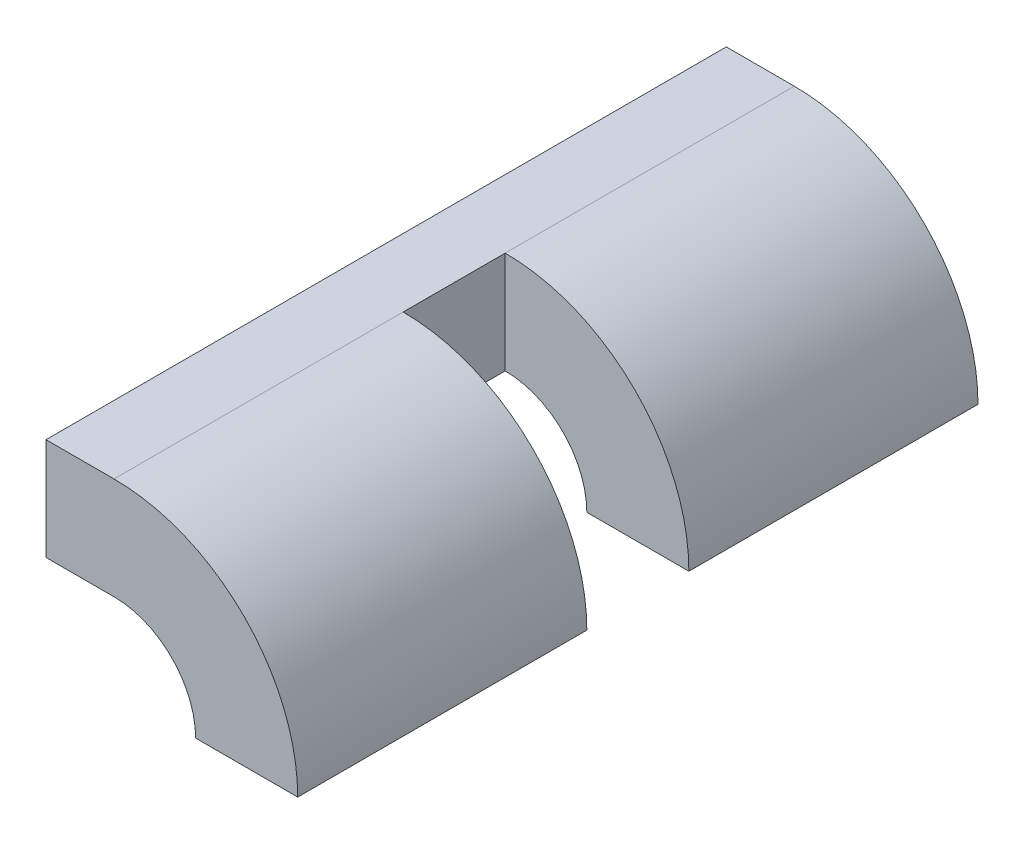
ISO-10303-21;
HEADER;
FILE_DESCRIPTION(('STEP AP214'),'2;1');
FILE_NAME('part.step','',(''),(''),'','','');
FILE_SCHEMA(('AUTOMOTIVE_DESIGN { 1 0 10303 214 1 1 1 1 }'));
ENDSEC;
DATA;
#1=APPLICATION_CONTEXT('core data for automotive mechanical design processes');
#2=APPLICATION_PROTOCOL_DEFINITION('international standard','automotive_design',2000,#1);
#3=PRODUCT_CONTEXT('',#1,'mechanical');
#4=PRODUCT('Part','Part','',(#3));
#5=PRODUCT_RELATED_PRODUCT_CATEGORY('part','',(#4));
#6=PRODUCT_DEFINITION_FORMATION('','',#4);
#7=PRODUCT_DEFINITION_CONTEXT('part definition',#1,'design');
#8=PRODUCT_DEFINITION('design','',#6,#7);
#9=PRODUCT_DEFINITION_SHAPE('','',#8);
#10=(LENGTH_UNIT() NAMED_UNIT(*) SI_UNIT(.MILLI.,.METRE.));
#11=(NAMED_UNIT(*) PLANE_ANGLE_UNIT() SI_UNIT($,.RADIAN.));
#12=(NAMED_UNIT(*) SI_UNIT($,.STERADIAN.) SOLID_ANGLE_UNIT());
#13=UNCERTAINTY_MEASURE_WITH_UNIT(LENGTH_MEASURE(1.E-05),#10,'distance_accuracy_value','');
#14=(GEOMETRIC_REPRESENTATION_CONTEXT(3) GLOBAL_UNCERTAINTY_ASSIGNED_CONTEXT((#13)) GLOBAL_UNIT_ASSIGNED_CONTEXT((#10,
#11,#12)) REPRESENTATION_CONTEXT('',''));
#15=CARTESIAN_POINT('',(0.,0.,0.));
#16=DIRECTION('',(0.,0.,1.));
#17=DIRECTION('',(1.,0.,0.));
#18=AXIS2_PLACEMENT_3D('',#15,#16,#17);
#19=CARTESIAN_POINT('',(20.,-24.,200.));
#20=DIRECTION('',(0.,0.,-1.));
#21=DIRECTION('',(-1.,0.,0.));
#22=AXIS2_PLACEMENT_3D('',#19,#20,#21);
#23=CYLINDRICAL_SURFACE('',#22,24.);
#24=CARTESIAN_POINT('',(20.,-24.,85.));
#25=DIRECTION('',(0.,0.,1.));
#26=DIRECTION('',(0.,-1.,0.));
#27=AXIS2_PLACEMENT_3D('',#24,#25,#26);
#28=CIRCLE('',#27,24.);
#29=CARTESIAN_POINT('',(20.,0.,85.));
#30=VERTEX_POINT('',#29);
#31=CARTESIAN_POINT('',(44.,-24.,85.));
#32=VERTEX_POINT('',#31);
#33=EDGE_CURVE('E128',#30,#32,#28,.F.);
#34=ORIENTED_EDGE('',*,*,#33,.F.);
#35=DIRECTION('',(0.,0.,-1.));
#36=VECTOR('',#35,1.);
#37=CARTESIAN_POINT('',(20.,0.,200.));
#38=LINE('',#37,#36);
#39=CARTESIAN_POINT('',(20.,0.,0.));
#40=VERTEX_POINT('',#39);
#41=EDGE_CURVE('E195',#30,#40,#38,.T.);
#42=ORIENTED_EDGE('',*,*,#41,.T.);
#43=CARTESIAN_POINT('',(20.,-24.,0.));
#44=DIRECTION('',(0.,0.,1.));
#45=DIRECTION('',(1.,0.,0.));
#46=AXIS2_PLACEMENT_3D('',#43,#44,#45);
#47=CIRCLE('',#46,24.);
#48=CARTESIAN_POINT('',(44.,-24.,0.));
#49=VERTEX_POINT('',#48);
#50=EDGE_CURVE('E215',#40,#49,#47,.F.);
#51=ORIENTED_EDGE('',*,*,#50,.T.);
#52=DIRECTION('',(0.,0.,-1.));
#53=VECTOR('',#52,1.);
#54=CARTESIAN_POINT('',(44.,-24.,200.));
#55=LINE('',#54,#53);
#56=EDGE_CURVE('E154',#32,#49,#55,.T.);
#57=ORIENTED_EDGE('',*,*,#56,.F.);
#58=EDGE_LOOP('',(#34,#42,#51,#57));
#59=FACE_BOUND('',#58,.T.);
#60=ADVANCED_FACE('F41',(#59),#23,.F.);
#61=CARTESIAN_POINT('',(20.,-24.,115.));
#62=DIRECTION('',(0.,0.,-1.));
#63=DIRECTION('',(-1.,0.,0.));
#64=AXIS2_PLACEMENT_3D('',#61,#62,#63);
#65=CIRCLE('',#64,24.);
#66=CARTESIAN_POINT('',(44.,-24.,115.));
#67=VERTEX_POINT('',#66);
#68=CARTESIAN_POINT('',(20.,0.,115.));
#69=VERTEX_POINT('',#68);
#70=EDGE_CURVE('E232',#67,#69,#65,.F.);
#71=ORIENTED_EDGE('',*,*,#70,.F.);
#72=CARTESIAN_POINT('',(44.,-24.,200.));
#73=VERTEX_POINT('',#72);
#74=EDGE_CURVE('E162',#73,#67,#55,.T.);
#75=ORIENTED_EDGE('',*,*,#74,.F.);
#76=CARTESIAN_POINT('',(20.,-24.,200.));
#77=DIRECTION('',(0.,0.,1.));
#78=DIRECTION('',(1.,0.,0.));
#79=AXIS2_PLACEMENT_3D('',#76,#77,#78);
#80=CIRCLE('',#79,24.);
#81=CARTESIAN_POINT('',(20.,0.,200.));
#82=VERTEX_POINT('',#81);
#83=EDGE_CURVE('E224',#82,#73,#80,.F.);
#84=ORIENTED_EDGE('',*,*,#83,.F.);
#85=EDGE_CURVE('E191',#82,#69,#38,.T.);
#86=ORIENTED_EDGE('',*,*,#85,.T.);
#87=EDGE_LOOP('',(#71,#75,#84,#86));
#88=FACE_BOUND('',#87,.T.);
#89=ADVANCED_FACE('F261',(#88),#23,.F.);
#90=CARTESIAN_POINT('',(0.,-24.,200.));
#91=DIRECTION('',(0.,1.,0.));
#92=DIRECTION('',(0.,0.,1.));
#93=AXIS2_PLACEMENT_3D('',#90,#91,#92);
#94=PLANE('',#93);
#95=DIRECTION('',(1.,0.,0.));
#96=VECTOR('',#95,1.);
#97=CARTESIAN_POINT('',(20.,-24.,85.));
#98=LINE('',#97,#96);
#99=CARTESIAN_POINT('',(74.,-24.,85.));
#100=VERTEX_POINT('',#99);
#101=EDGE_CURVE('E124',#32,#100,#98,.T.);
#102=ORIENTED_EDGE('',*,*,#101,.F.);
#103=ORIENTED_EDGE('',*,*,#56,.T.);
#104=DIRECTION('',(1.,0.,0.));
#105=VECTOR('',#104,1.);
#106=CARTESIAN_POINT('',(0.,-24.,0.));
#107=LINE('',#106,#105);
#108=CARTESIAN_POINT('',(74.,-24.,0.));
#109=VERTEX_POINT('',#108);
#110=EDGE_CURVE('E145',#49,#109,#107,.T.);
#111=ORIENTED_EDGE('',*,*,#110,.T.);
#112=DIRECTION('',(0.,0.,-1.));
#113=VECTOR('',#112,1.);
#114=CARTESIAN_POINT('',(74.,-24.,200.));
#115=LINE('',#114,#113);
#116=EDGE_CURVE('E139',#100,#109,#115,.T.);
#117=ORIENTED_EDGE('',*,*,#116,.F.);
#118=EDGE_LOOP('',(#102,#103,#111,#117));
#119=FACE_BOUND('',#118,.T.);
#120=ADVANCED_FACE('F143',(#119),#94,.F.);
#121=DIRECTION('',(1.,0.,0.));
#122=VECTOR('',#121,1.);
#123=CARTESIAN_POINT('',(20.,-24.,115.));
#124=LINE('',#123,#122);
#125=CARTESIAN_POINT('',(74.,-24.,115.));
#126=VERTEX_POINT('',#125);
#127=EDGE_CURVE('E134',#67,#126,#124,.T.);
#128=ORIENTED_EDGE('',*,*,#127,.T.);
#129=CARTESIAN_POINT('',(74.,-24.,200.));
#130=VERTEX_POINT('',#129);
#131=EDGE_CURVE('E148',#130,#126,#115,.T.);
#132=ORIENTED_EDGE('',*,*,#131,.F.);
#133=DIRECTION('',(1.,0.,0.));
#134=VECTOR('',#133,1.);
#135=CARTESIAN_POINT('',(0.,-24.,200.));
#136=LINE('',#135,#134);
#137=EDGE_CURVE('E156',#73,#130,#136,.T.);
#138=ORIENTED_EDGE('',*,*,#137,.F.);
#139=ORIENTED_EDGE('',*,*,#74,.T.);
#140=EDGE_LOOP('',(#128,#132,#138,#139));
#141=FACE_BOUND('',#140,.T.);
#142=ADVANCED_FACE('F257',(#141),#94,.F.);
#143=CARTESIAN_POINT('',(20.,-24.,200.));
#144=DIRECTION('',(0.,0.,-1.));
#145=DIRECTION('',(-1.,0.,0.));
#146=AXIS2_PLACEMENT_3D('',#143,#144,#145);
#147=CYLINDRICAL_SURFACE('',#146,54.);
#148=DIRECTION('',(0.,0.,-1.));
#149=VECTOR('',#148,1.);
#150=CARTESIAN_POINT('',(20.,30.,200.));
#151=LINE('',#150,#149);
#152=CARTESIAN_POINT('',(20.,30.,85.));
#153=VERTEX_POINT('',#152);
#154=CARTESIAN_POINT('',(20.,30.,0.));
#155=VERTEX_POINT('',#154);
#156=EDGE_CURVE('E141',#153,#155,#151,.T.);
#157=ORIENTED_EDGE('',*,*,#156,.F.);
#158=CARTESIAN_POINT('',(20.,-24.,85.));
#159=DIRECTION('',(0.,0.,1.));
#160=DIRECTION('',(0.,-1.,0.));
#161=AXIS2_PLACEMENT_3D('',#158,#159,#160);
#162=CIRCLE('',#161,54.);
#163=EDGE_CURVE('E11',#153,#100,#162,.F.);
#164=ORIENTED_EDGE('',*,*,#163,.T.);
#165=ORIENTED_EDGE('',*,*,#116,.T.);
#166=CARTESIAN_POINT('',(20.,-24.,0.));
#167=DIRECTION('',(0.,0.,1.));
#168=DIRECTION('',(1.,0.,0.));
#169=AXIS2_PLACEMENT_3D('',#166,#167,#168);
#170=CIRCLE('',#169,54.);
#171=EDGE_CURVE('E160',#155,#109,#170,.F.);
#172=ORIENTED_EDGE('',*,*,#171,.F.);
#173=EDGE_LOOP('',(#157,#164,#165,#172));
#174=FACE_BOUND('',#173,.T.);
#175=ADVANCED_FACE('F137',(#174),#147,.T.);
#176=ORIENTED_EDGE('',*,*,#131,.T.);
#177=CARTESIAN_POINT('',(20.,-24.,115.));
#178=DIRECTION('',(0.,0.,-1.));
#179=DIRECTION('',(-1.,0.,0.));
#180=AXIS2_PLACEMENT_3D('',#177,#178,#179);
#181=CIRCLE('',#180,54.);
#182=CARTESIAN_POINT('',(20.,30.,115.));
#183=VERTEX_POINT('',#182);
#184=EDGE_CURVE('E50',#126,#183,#181,.F.);
#185=ORIENTED_EDGE('',*,*,#184,.T.);
#186=CARTESIAN_POINT('',(20.,30.,200.));
#187=VERTEX_POINT('',#186);
#188=EDGE_CURVE('E196',#187,#183,#151,.T.);
#189=ORIENTED_EDGE('',*,*,#188,.F.);
#190=CARTESIAN_POINT('',(20.,-24.,200.));
#191=DIRECTION('',(0.,0.,1.));
#192=DIRECTION('',(1.,0.,0.));
#193=AXIS2_PLACEMENT_3D('',#190,#191,#192);
#194=CIRCLE('',#193,54.);
#195=EDGE_CURVE('E149',#187,#130,#194,.F.);
#196=ORIENTED_EDGE('',*,*,#195,.T.);
#197=EDGE_LOOP('',(#176,#185,#189,#196));
#198=FACE_BOUND('',#197,.T.);
#199=ADVANCED_FACE('F202',(#198),#147,.T.);
#200=CARTESIAN_POINT('',(0.,30.,200.));
#201=DIRECTION('',(0.,1.,0.));
#202=DIRECTION('',(0.,0.,1.));
#203=AXIS2_PLACEMENT_3D('',#200,#201,#202);
#204=PLANE('',#203);
#205=DIRECTION('',(1.,0.,0.));
#206=VECTOR('',#205,1.);
#207=CARTESIAN_POINT('',(0.,30.,0.));
#208=LINE('',#207,#206);
#209=CARTESIAN_POINT('',(0.,30.,0.));
#210=VERTEX_POINT('',#209);
#211=EDGE_CURVE('E166',#210,#155,#208,.T.);
#212=ORIENTED_EDGE('',*,*,#211,.F.);
#213=DIRECTION('',(0.,0.,-1.));
#214=VECTOR('',#213,1.);
#215=CARTESIAN_POINT('',(0.,30.,200.));
#216=LINE('',#215,#214);
#217=CARTESIAN_POINT('',(0.,30.,200.));
#218=VERTEX_POINT('',#217);
#219=EDGE_CURVE('E66',#218,#210,#216,.T.);
#220=ORIENTED_EDGE('',*,*,#219,.F.);
#221=DIRECTION('',(1.,0.,0.));
#222=VECTOR('',#221,1.);
#223=CARTESIAN_POINT('',(0.,30.,200.));
#224=LINE('',#223,#222);
#225=EDGE_CURVE('E86',#218,#187,#224,.T.);
#226=ORIENTED_EDGE('',*,*,#225,.T.);
#227=ORIENTED_EDGE('',*,*,#188,.T.);
#228=EDGE_CURVE('E198',#183,#153,#151,.T.);
#229=ORIENTED_EDGE('',*,*,#228,.T.);
#230=ORIENTED_EDGE('',*,*,#156,.T.);
#231=EDGE_LOOP('',(#212,#220,#226,#227,#229,#230));
#232=FACE_BOUND('',#231,.T.);
#233=ADVANCED_FACE('F43',(#232),#204,.T.);
#234=CARTESIAN_POINT('',(0.,0.,200.));
#235=DIRECTION('',(-1.,0.,0.));
#236=DIRECTION('',(0.,0.,1.));
#237=AXIS2_PLACEMENT_3D('',#234,#235,#236);
#238=PLANE('',#237);
#239=DIRECTION('',(0.,1.,0.));
#240=VECTOR('',#239,1.);
#241=CARTESIAN_POINT('',(0.,0.,0.));
#242=LINE('',#241,#240);
#243=CARTESIAN_POINT('',(0.,0.,0.));
#244=VERTEX_POINT('',#243);
#245=EDGE_CURVE('E170',#244,#210,#242,.T.);
#246=ORIENTED_EDGE('',*,*,#245,.F.);
#247=DIRECTION('',(0.,0.,-1.));
#248=VECTOR('',#247,1.);
#249=CARTESIAN_POINT('',(0.,0.,200.));
#250=LINE('',#249,#248);
#251=CARTESIAN_POINT('',(0.,0.,200.));
#252=VERTEX_POINT('',#251);
#253=EDGE_CURVE('E188',#252,#244,#250,.T.);
#254=ORIENTED_EDGE('',*,*,#253,.F.);
#255=DIRECTION('',(0.,1.,0.));
#256=VECTOR('',#255,1.);
#257=CARTESIAN_POINT('',(0.,0.,200.));
#258=LINE('',#257,#256);
#259=EDGE_CURVE('E173',#252,#218,#258,.T.);
#260=ORIENTED_EDGE('',*,*,#259,.T.);
#261=ORIENTED_EDGE('',*,*,#219,.T.);
#262=EDGE_LOOP('',(#246,#254,#260,#261));
#263=FACE_BOUND('',#262,.T.);
#264=ADVANCED_FACE('F249',(#263),#238,.T.);
#265=CARTESIAN_POINT('',(0.,0.,200.));
#266=DIRECTION('',(0.,1.,0.));
#267=DIRECTION('',(0.,0.,1.));
#268=AXIS2_PLACEMENT_3D('',#265,#266,#267);
#269=PLANE('',#268);
#270=DIRECTION('',(1.,0.,0.));
#271=VECTOR('',#270,1.);
#272=CARTESIAN_POINT('',(0.,0.,0.));
#273=LINE('',#272,#271);
#274=EDGE_CURVE('E179',#244,#40,#273,.T.);
#275=ORIENTED_EDGE('',*,*,#274,.T.);
#276=ORIENTED_EDGE('',*,*,#41,.F.);
#277=DIRECTION('',(0.,0.,-1.));
#278=VECTOR('',#277,1.);
#279=CARTESIAN_POINT('',(20.,0.,200.));
#280=LINE('',#279,#278);
#281=EDGE_CURVE('E133',#30,#69,#280,.F.);
#282=ORIENTED_EDGE('',*,*,#281,.T.);
#283=ORIENTED_EDGE('',*,*,#85,.F.);
#284=DIRECTION('',(1.,0.,0.));
#285=VECTOR('',#284,1.);
#286=CARTESIAN_POINT('',(0.,0.,200.));
#287=LINE('',#286,#285);
#288=EDGE_CURVE('E169',#252,#82,#287,.T.);
#289=ORIENTED_EDGE('',*,*,#288,.F.);
#290=ORIENTED_EDGE('',*,*,#253,.T.);
#291=EDGE_LOOP('',(#275,#276,#282,#283,#289,#290));
#292=FACE_BOUND('',#291,.T.);
#293=ADVANCED_FACE('F245',(#292),#269,.F.);
#294=CARTESIAN_POINT('',(0.,0.,200.));
#295=DIRECTION('',(0.,0.,1.));
#296=DIRECTION('',(1.,0.,0.));
#297=AXIS2_PLACEMENT_3D('',#294,#295,#296);
#298=PLANE('',#297);
#299=ORIENTED_EDGE('',*,*,#225,.F.);
#300=ORIENTED_EDGE('',*,*,#259,.F.);
#301=ORIENTED_EDGE('',*,*,#288,.T.);
#302=ORIENTED_EDGE('',*,*,#83,.T.);
#303=ORIENTED_EDGE('',*,*,#137,.T.);
#304=ORIENTED_EDGE('',*,*,#195,.F.);
#305=EDGE_LOOP('',(#299,#300,#301,#302,#303,#304));
#306=FACE_BOUND('',#305,.T.);
#307=ADVANCED_FACE('F253',(#306),#298,.T.);
#308=CARTESIAN_POINT('',(0.,0.,0.));
#309=DIRECTION('',(0.,0.,1.));
#310=DIRECTION('',(1.,0.,0.));
#311=AXIS2_PLACEMENT_3D('',#308,#309,#310);
#312=PLANE('',#311);
#313=ORIENTED_EDGE('',*,*,#211,.T.);
#314=ORIENTED_EDGE('',*,*,#171,.T.);
#315=ORIENTED_EDGE('',*,*,#110,.F.);
#316=ORIENTED_EDGE('',*,*,#50,.F.);
#317=ORIENTED_EDGE('',*,*,#274,.F.);
#318=ORIENTED_EDGE('',*,*,#245,.T.);
#319=EDGE_LOOP('',(#313,#314,#315,#316,#317,#318));
#320=FACE_BOUND('',#319,.T.);
#321=ADVANCED_FACE('F221',(#320),#312,.F.);
#322=CARTESIAN_POINT('',(20.,55.3891151315196,85.));
#323=DIRECTION('',(0.,0.,1.));
#324=DIRECTION('',(0.,-1.,0.));
#325=AXIS2_PLACEMENT_3D('',#322,#323,#324);
#326=PLANE('',#325);
#327=ORIENTED_EDGE('',*,*,#33,.T.);
#328=ORIENTED_EDGE('',*,*,#101,.T.);
#329=ORIENTED_EDGE('',*,*,#163,.F.);
#330=DIRECTION('',(0.,-1.,0.));
#331=VECTOR('',#330,1.);
#332=CARTESIAN_POINT('',(20.,55.3891151315196,85.));
#333=LINE('',#332,#331);
#334=EDGE_CURVE('E57',#153,#30,#333,.T.);
#335=ORIENTED_EDGE('',*,*,#334,.T.);
#336=EDGE_LOOP('',(#327,#328,#329,#335));
#337=FACE_BOUND('',#336,.T.);
#338=ADVANCED_FACE('F125',(#337),#326,.T.);
#339=CARTESIAN_POINT('',(20.,-24.,115.));
#340=DIRECTION('',(0.,0.,-1.));
#341=DIRECTION('',(-1.,0.,0.));
#342=AXIS2_PLACEMENT_3D('',#339,#340,#341);
#343=PLANE('',#342);
#344=ORIENTED_EDGE('',*,*,#70,.T.);
#345=DIRECTION('',(0.,1.,0.));
#346=VECTOR('',#345,1.);
#347=CARTESIAN_POINT('',(20.,-24.,115.));
#348=LINE('',#347,#346);
#349=EDGE_CURVE('E240',#69,#183,#348,.T.);
#350=ORIENTED_EDGE('',*,*,#349,.T.);
#351=ORIENTED_EDGE('',*,*,#184,.F.);
#352=ORIENTED_EDGE('',*,*,#127,.F.);
#353=EDGE_LOOP('',(#344,#350,#351,#352));
#354=FACE_BOUND('',#353,.T.);
#355=ADVANCED_FACE('F259',(#354),#343,.T.);
#356=CARTESIAN_POINT('',(20.,0.,0.));
#357=DIRECTION('',(-1.,0.,0.));
#358=DIRECTION('',(0.,0.,1.));
#359=AXIS2_PLACEMENT_3D('',#356,#357,#358);
#360=PLANE('',#359);
#361=ORIENTED_EDGE('',*,*,#334,.F.);
#362=ORIENTED_EDGE('',*,*,#228,.F.);
#363=ORIENTED_EDGE('',*,*,#349,.F.);
#364=ORIENTED_EDGE('',*,*,#281,.F.);
#365=EDGE_LOOP('',(#361,#362,#363,#364));
#366=FACE_BOUND('',#365,.T.);
#367=ADVANCED_FACE('F304',(#366),#360,.F.);
#368=CLOSED_SHELL('',(#60,#89,#120,#142,#175,#199,#233,#264,#293,#307,#321,#338,#355,#367));
#369=MANIFOLD_SOLID_BREP('B2',#368);
#370=ADVANCED_BREP_SHAPE_REPRESENTATION('',(#18,#369),#14);
#371=SHAPE_DEFINITION_REPRESENTATION(#9,#370);
ENDSEC;
END-ISO-10303-21;
